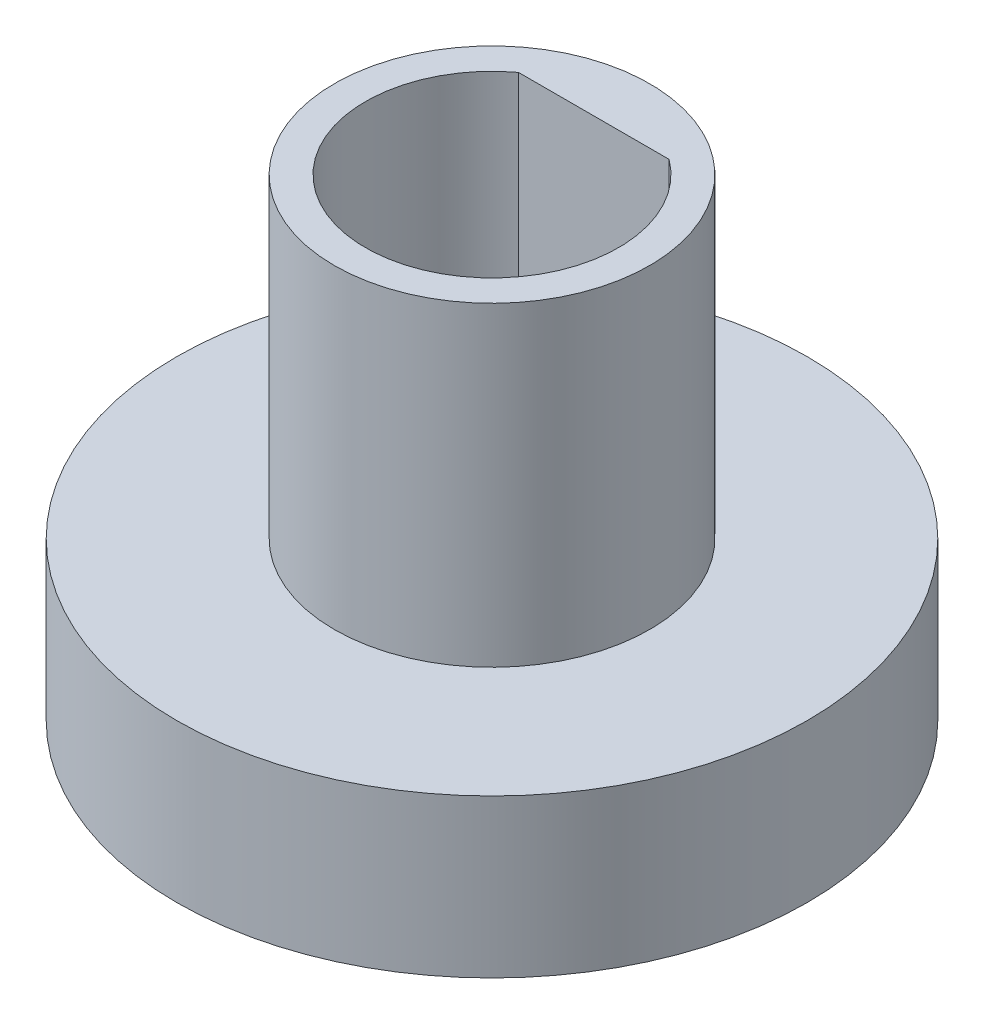
ISO-10303-21;
HEADER;
FILE_DESCRIPTION(('STEP AP214'),'2;1');
FILE_NAME('part.step','',(''),(''),'','','');
FILE_SCHEMA(('AUTOMOTIVE_DESIGN { 1 0 10303 214 1 1 1 1 }'));
ENDSEC;
DATA;
#1=APPLICATION_CONTEXT('core data for automotive mechanical design processes');
#2=APPLICATION_PROTOCOL_DEFINITION('international standard','automotive_design',2000,#1);
#3=PRODUCT_CONTEXT('',#1,'mechanical');
#4=PRODUCT('Part','Part','',(#3));
#5=PRODUCT_RELATED_PRODUCT_CATEGORY('part','',(#4));
#6=PRODUCT_DEFINITION_FORMATION('','',#4);
#7=PRODUCT_DEFINITION_CONTEXT('part definition',#1,'design');
#8=PRODUCT_DEFINITION('design','',#6,#7);
#9=PRODUCT_DEFINITION_SHAPE('','',#8);
#10=(LENGTH_UNIT() NAMED_UNIT(*) SI_UNIT(.MILLI.,.METRE.));
#11=(NAMED_UNIT(*) PLANE_ANGLE_UNIT() SI_UNIT($,.RADIAN.));
#12=(NAMED_UNIT(*) SI_UNIT($,.STERADIAN.) SOLID_ANGLE_UNIT());
#13=UNCERTAINTY_MEASURE_WITH_UNIT(LENGTH_MEASURE(1.E-05),#10,'distance_accuracy_value','');
#14=(GEOMETRIC_REPRESENTATION_CONTEXT(3) GLOBAL_UNCERTAINTY_ASSIGNED_CONTEXT((#13)) GLOBAL_UNIT_ASSIGNED_CONTEXT((#10,
#11,#12)) REPRESENTATION_CONTEXT('',''));
#15=CARTESIAN_POINT('',(0.,0.,0.));
#16=DIRECTION('',(0.,0.,1.));
#17=DIRECTION('',(1.,0.,0.));
#18=AXIS2_PLACEMENT_3D('',#15,#16,#17);
#19=CARTESIAN_POINT('',(0.,3.175,0.));
#20=DIRECTION('',(0.,-1.,0.));
#21=DIRECTION('',(0.,0.,-1.));
#22=AXIS2_PLACEMENT_3D('',#19,#20,#21);
#23=CYLINDRICAL_SURFACE('',#22,6.35);
#24=CARTESIAN_POINT('',(0.,3.175,0.));
#25=DIRECTION('',(0.,1.,0.));
#26=DIRECTION('',(0.,0.,1.));
#27=AXIS2_PLACEMENT_3D('',#24,#25,#26);
#28=CIRCLE('',#27,6.35);
#29=CARTESIAN_POINT('',(0.,3.175,6.35));
#30=VERTEX_POINT('',#29);
#31=EDGE_CURVE('E48',#30,#30,#28,.T.);
#32=ORIENTED_EDGE('',*,*,#31,.F.);
#33=EDGE_LOOP('',(#32));
#34=FACE_BOUND('',#33,.T.);
#35=CARTESIAN_POINT('',(0.,0.,0.));
#36=DIRECTION('',(0.,1.,0.));
#37=DIRECTION('',(0.,0.,1.));
#38=AXIS2_PLACEMENT_3D('',#35,#36,#37);
#39=CIRCLE('',#38,6.35);
#40=CARTESIAN_POINT('',(0.,0.,6.35));
#41=VERTEX_POINT('',#40);
#42=EDGE_CURVE('E42',#41,#41,#39,.T.);
#43=ORIENTED_EDGE('',*,*,#42,.T.);
#44=EDGE_LOOP('',(#43));
#45=FACE_BOUND('',#44,.T.);
#46=ADVANCED_FACE('F39',(#34,#45),#23,.T.);
#47=CARTESIAN_POINT('',(0.,3.175,0.));
#48=DIRECTION('',(0.,1.,0.));
#49=DIRECTION('',(0.,0.,1.));
#50=AXIS2_PLACEMENT_3D('',#47,#48,#49);
#51=PLANE('',#50);
#52=CARTESIAN_POINT('',(0.,3.175,0.));
#53=DIRECTION('',(0.,1.,0.));
#54=DIRECTION('',(0.,0.,1.));
#55=AXIS2_PLACEMENT_3D('',#52,#53,#54);
#56=CIRCLE('',#55,3.175);
#57=CARTESIAN_POINT('',(0.,3.175,3.175));
#58=VERTEX_POINT('',#57);
#59=EDGE_CURVE('E11',#58,#58,#56,.T.);
#60=ORIENTED_EDGE('',*,*,#59,.F.);
#61=EDGE_LOOP('',(#60));
#62=FACE_BOUND('',#61,.T.);
#63=ORIENTED_EDGE('',*,*,#31,.T.);
#64=EDGE_LOOP('',(#63));
#65=FACE_BOUND('',#64,.T.);
#66=ADVANCED_FACE('F106',(#62,#65),#51,.T.);
#67=CARTESIAN_POINT('',(0.,0.,0.));
#68=DIRECTION('',(0.,1.,0.));
#69=DIRECTION('',(0.,0.,1.));
#70=AXIS2_PLACEMENT_3D('',#67,#68,#69);
#71=PLANE('',#70);
#72=DIRECTION('',(-1.,0.,0.));
#73=VECTOR('',#72,1.);
#74=CARTESIAN_POINT('',(-1.51657508881031,0.,-2.05));
#75=LINE('',#74,#73);
#76=CARTESIAN_POINT('',(1.51657508881031,0.,-2.05));
#77=VERTEX_POINT('',#76);
#78=CARTESIAN_POINT('',(-1.51657508881031,0.,-2.05));
#79=VERTEX_POINT('',#78);
#80=EDGE_CURVE('E87',#77,#79,#75,.T.);
#81=ORIENTED_EDGE('',*,*,#80,.T.);
#82=CARTESIAN_POINT('',(0.,0.,0.));
#83=DIRECTION('',(0.,1.,0.));
#84=DIRECTION('',(0.,0.,1.));
#85=AXIS2_PLACEMENT_3D('',#82,#83,#84);
#86=CIRCLE('',#85,2.55);
#87=EDGE_CURVE('E56',#79,#77,#86,.T.);
#88=ORIENTED_EDGE('',*,*,#87,.T.);
#89=EDGE_LOOP('',(#81,#88));
#90=FACE_BOUND('',#89,.T.);
#91=ORIENTED_EDGE('',*,*,#42,.F.);
#92=EDGE_LOOP('',(#91));
#93=FACE_BOUND('',#92,.T.);
#94=ADVANCED_FACE('F103',(#90,#93),#71,.F.);
#95=CARTESIAN_POINT('',(0.,9.525,0.));
#96=DIRECTION('',(0.,-1.,0.));
#97=DIRECTION('',(0.,0.,-1.));
#98=AXIS2_PLACEMENT_3D('',#95,#96,#97);
#99=CYLINDRICAL_SURFACE('',#98,3.175);
#100=CARTESIAN_POINT('',(0.,9.525,0.));
#101=DIRECTION('',(0.,1.,0.));
#102=DIRECTION('',(0.,0.,1.));
#103=AXIS2_PLACEMENT_3D('',#100,#101,#102);
#104=CIRCLE('',#103,3.175);
#105=CARTESIAN_POINT('',(0.,9.525,3.175));
#106=VERTEX_POINT('',#105);
#107=EDGE_CURVE('E73',#106,#106,#104,.T.);
#108=ORIENTED_EDGE('',*,*,#107,.F.);
#109=EDGE_LOOP('',(#108));
#110=FACE_BOUND('',#109,.T.);
#111=ORIENTED_EDGE('',*,*,#59,.T.);
#112=EDGE_LOOP('',(#111));
#113=FACE_BOUND('',#112,.T.);
#114=ADVANCED_FACE('F105',(#110,#113),#99,.T.);
#115=CARTESIAN_POINT('',(0.,9.525,0.));
#116=DIRECTION('',(0.,1.,0.));
#117=DIRECTION('',(0.,0.,1.));
#118=AXIS2_PLACEMENT_3D('',#115,#116,#117);
#119=PLANE('',#118);
#120=CARTESIAN_POINT('',(0.,9.525,0.));
#121=DIRECTION('',(0.,1.,0.));
#122=DIRECTION('',(0.,0.,1.));
#123=AXIS2_PLACEMENT_3D('',#120,#121,#122);
#124=CIRCLE('',#123,2.55);
#125=CARTESIAN_POINT('',(-1.51657508881031,9.525,-2.05));
#126=VERTEX_POINT('',#125);
#127=CARTESIAN_POINT('',(1.51657508881031,9.525,-2.05));
#128=VERTEX_POINT('',#127);
#129=EDGE_CURVE('E61',#126,#128,#124,.T.);
#130=ORIENTED_EDGE('',*,*,#129,.F.);
#131=DIRECTION('',(-1.,0.,0.));
#132=VECTOR('',#131,1.);
#133=CARTESIAN_POINT('',(-1.51657508881031,9.525,-2.05));
#134=LINE('',#133,#132);
#135=EDGE_CURVE('E77',#128,#126,#134,.T.);
#136=ORIENTED_EDGE('',*,*,#135,.F.);
#137=EDGE_LOOP('',(#130,#136));
#138=FACE_BOUND('',#137,.T.);
#139=ORIENTED_EDGE('',*,*,#107,.T.);
#140=EDGE_LOOP('',(#139));
#141=FACE_BOUND('',#140,.T.);
#142=ADVANCED_FACE('F82',(#138,#141),#119,.T.);
#143=CARTESIAN_POINT('',(0.,0.,0.));
#144=DIRECTION('',(0.,1.,0.));
#145=DIRECTION('',(0.,0.,1.));
#146=AXIS2_PLACEMENT_3D('',#143,#144,#145);
#147=CYLINDRICAL_SURFACE('',#146,2.55);
#148=ORIENTED_EDGE('',*,*,#129,.T.);
#149=DIRECTION('',(0.,1.,0.));
#150=VECTOR('',#149,1.);
#151=CARTESIAN_POINT('',(1.51657508881031,0.,-2.05));
#152=LINE('',#151,#150);
#153=EDGE_CURVE('E74',#77,#128,#152,.T.);
#154=ORIENTED_EDGE('',*,*,#153,.F.);
#155=ORIENTED_EDGE('',*,*,#87,.F.);
#156=DIRECTION('',(0.,1.,0.));
#157=VECTOR('',#156,1.);
#158=CARTESIAN_POINT('',(-1.51657508881031,0.,-2.05));
#159=LINE('',#158,#157);
#160=EDGE_CURVE('E66',#79,#126,#159,.T.);
#161=ORIENTED_EDGE('',*,*,#160,.T.);
#162=EDGE_LOOP('',(#148,#154,#155,#161));
#163=FACE_BOUND('',#162,.T.);
#164=ADVANCED_FACE('F68',(#163),#147,.F.);
#165=CARTESIAN_POINT('',(-1.51657508881031,0.,-2.05));
#166=DIRECTION('',(0.,0.,-1.));
#167=DIRECTION('',(-1.,0.,0.));
#168=AXIS2_PLACEMENT_3D('',#165,#166,#167);
#169=PLANE('',#168);
#170=ORIENTED_EDGE('',*,*,#135,.T.);
#171=ORIENTED_EDGE('',*,*,#160,.F.);
#172=ORIENTED_EDGE('',*,*,#80,.F.);
#173=ORIENTED_EDGE('',*,*,#153,.T.);
#174=EDGE_LOOP('',(#170,#171,#172,#173));
#175=FACE_BOUND('',#174,.T.);
#176=ADVANCED_FACE('F78',(#175),#169,.F.);
#177=CLOSED_SHELL('',(#46,#66,#94,#114,#142,#164,#176));
#178=MANIFOLD_SOLID_BREP('B2',#177);
#179=ADVANCED_BREP_SHAPE_REPRESENTATION('',(#18,#178),#14);
#180=SHAPE_DEFINITION_REPRESENTATION(#9,#179);
ENDSEC;
END-ISO-10303-21;
